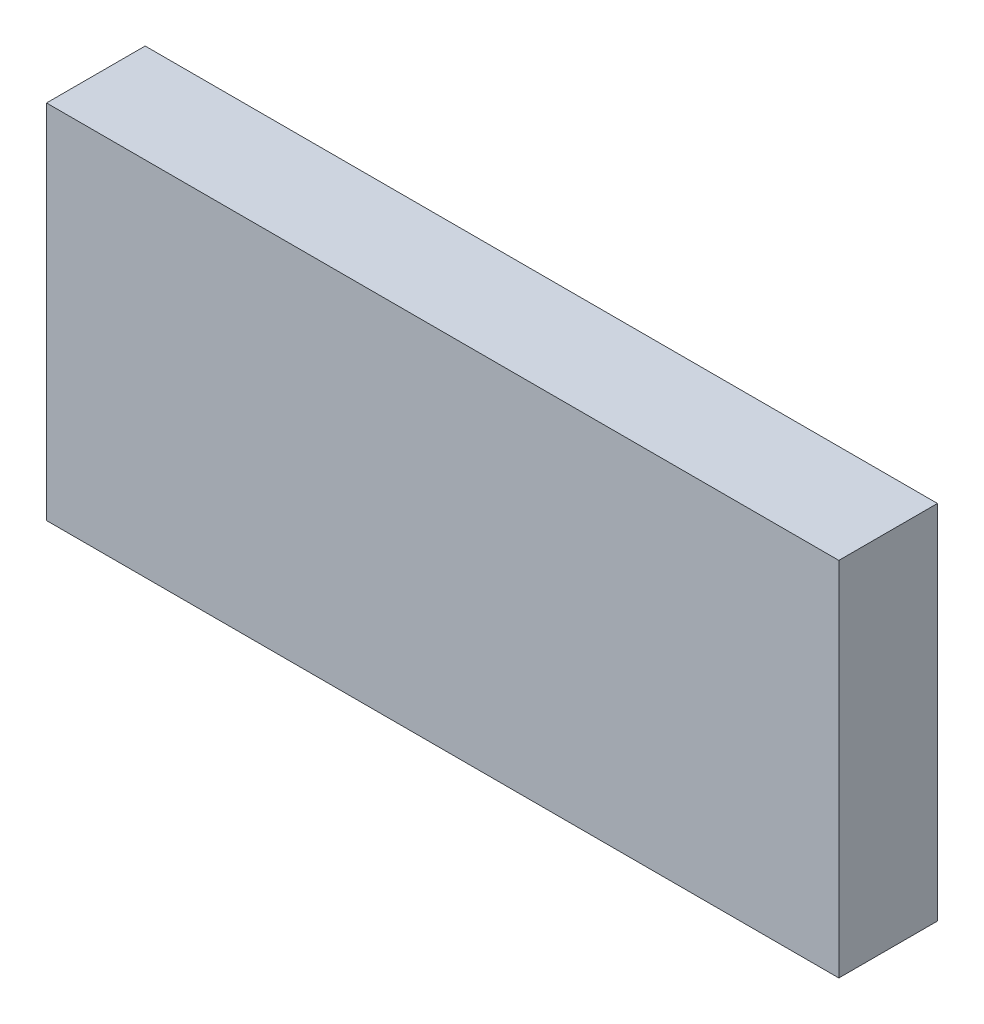
ISO-10303-21;
HEADER;
FILE_DESCRIPTION(('STEP AP214'),'2;1');
FILE_NAME('part.step','',(''),(''),'','','');
FILE_SCHEMA(('AUTOMOTIVE_DESIGN { 1 0 10303 214 1 1 1 1 }'));
ENDSEC;
DATA;
#1=APPLICATION_CONTEXT('core data for automotive mechanical design processes');
#2=APPLICATION_PROTOCOL_DEFINITION('international standard','automotive_design',2000,#1);
#3=PRODUCT_CONTEXT('',#1,'mechanical');
#4=PRODUCT('Part','Part','',(#3));
#5=PRODUCT_RELATED_PRODUCT_CATEGORY('part','',(#4));
#6=PRODUCT_DEFINITION_FORMATION('','',#4);
#7=PRODUCT_DEFINITION_CONTEXT('part definition',#1,'design');
#8=PRODUCT_DEFINITION('design','',#6,#7);
#9=PRODUCT_DEFINITION_SHAPE('','',#8);
#10=(LENGTH_UNIT() NAMED_UNIT(*) SI_UNIT(.MILLI.,.METRE.));
#11=(NAMED_UNIT(*) PLANE_ANGLE_UNIT() SI_UNIT($,.RADIAN.));
#12=(NAMED_UNIT(*) SI_UNIT($,.STERADIAN.) SOLID_ANGLE_UNIT());
#13=UNCERTAINTY_MEASURE_WITH_UNIT(LENGTH_MEASURE(1.E-05),#10,'distance_accuracy_value','');
#14=(GEOMETRIC_REPRESENTATION_CONTEXT(3) GLOBAL_UNCERTAINTY_ASSIGNED_CONTEXT((#13)) GLOBAL_UNIT_ASSIGNED_CONTEXT((#10,
#11,#12)) REPRESENTATION_CONTEXT('',''));
#15=CARTESIAN_POINT('',(0.,0.,0.));
#16=DIRECTION('',(0.,0.,1.));
#17=DIRECTION('',(1.,0.,0.));
#18=AXIS2_PLACEMENT_3D('',#15,#16,#17);
#19=CARTESIAN_POINT('',(153.02484,-69.85,-38.1));
#20=DIRECTION('',(1.,0.,0.));
#21=DIRECTION('',(0.,0.,-1.));
#22=AXIS2_PLACEMENT_3D('',#19,#20,#21);
#23=PLANE('',#22);
#24=DIRECTION('',(0.,1.,0.));
#25=VECTOR('',#24,1.);
#26=CARTESIAN_POINT('',(153.02484,-69.85,0.));
#27=LINE('',#26,#25);
#28=CARTESIAN_POINT('',(153.02484,-69.85,0.));
#29=VERTEX_POINT('',#28);
#30=CARTESIAN_POINT('',(153.02484,69.85,0.));
#31=VERTEX_POINT('',#30);
#32=EDGE_CURVE('E105',#29,#31,#27,.T.);
#33=ORIENTED_EDGE('',*,*,#32,.F.);
#34=DIRECTION('',(0.,0.,1.));
#35=VECTOR('',#34,1.);
#36=CARTESIAN_POINT('',(153.02484,-69.85,-38.1));
#37=LINE('',#36,#35);
#38=CARTESIAN_POINT('',(153.02484,-69.85,-38.1));
#39=VERTEX_POINT('',#38);
#40=EDGE_CURVE('E11',#39,#29,#37,.T.);
#41=ORIENTED_EDGE('',*,*,#40,.F.);
#42=DIRECTION('',(0.,1.,0.));
#43=VECTOR('',#42,1.);
#44=CARTESIAN_POINT('',(153.02484,-69.85,-38.1));
#45=LINE('',#44,#43);
#46=CARTESIAN_POINT('',(153.02484,69.85,-38.1));
#47=VERTEX_POINT('',#46);
#48=EDGE_CURVE('E99',#39,#47,#45,.T.);
#49=ORIENTED_EDGE('',*,*,#48,.T.);
#50=DIRECTION('',(0.,0.,1.));
#51=VECTOR('',#50,1.);
#52=CARTESIAN_POINT('',(153.02484,69.85,-38.1));
#53=LINE('',#52,#51);
#54=EDGE_CURVE('E44',#47,#31,#53,.T.);
#55=ORIENTED_EDGE('',*,*,#54,.T.);
#56=EDGE_LOOP('',(#33,#41,#49,#55));
#57=FACE_BOUND('',#56,.T.);
#58=ADVANCED_FACE('F41',(#57),#23,.T.);
#59=CARTESIAN_POINT('',(-153.02484,-69.85,-38.1));
#60=DIRECTION('',(0.,-1.,0.));
#61=DIRECTION('',(0.,0.,-1.));
#62=AXIS2_PLACEMENT_3D('',#59,#60,#61);
#63=PLANE('',#62);
#64=DIRECTION('',(1.,0.,0.));
#65=VECTOR('',#64,1.);
#66=CARTESIAN_POINT('',(-153.02484,-69.85,0.));
#67=LINE('',#66,#65);
#68=CARTESIAN_POINT('',(-153.02484,-69.85,0.));
#69=VERTEX_POINT('',#68);
#70=EDGE_CURVE('E101',#69,#29,#67,.T.);
#71=ORIENTED_EDGE('',*,*,#70,.F.);
#72=DIRECTION('',(0.,0.,1.));
#73=VECTOR('',#72,1.);
#74=CARTESIAN_POINT('',(-153.02484,-69.85,-38.1));
#75=LINE('',#74,#73);
#76=CARTESIAN_POINT('',(-153.02484,-69.85,-38.1));
#77=VERTEX_POINT('',#76);
#78=EDGE_CURVE('E50',#77,#69,#75,.T.);
#79=ORIENTED_EDGE('',*,*,#78,.F.);
#80=DIRECTION('',(1.,0.,0.));
#81=VECTOR('',#80,1.);
#82=CARTESIAN_POINT('',(-153.02484,-69.85,-38.1));
#83=LINE('',#82,#81);
#84=EDGE_CURVE('E96',#77,#39,#83,.T.);
#85=ORIENTED_EDGE('',*,*,#84,.T.);
#86=ORIENTED_EDGE('',*,*,#40,.T.);
#87=EDGE_LOOP('',(#71,#79,#85,#86));
#88=FACE_BOUND('',#87,.T.);
#89=ADVANCED_FACE('F115',(#88),#63,.T.);
#90=CARTESIAN_POINT('',(-153.02484,-69.85,-38.1));
#91=DIRECTION('',(-1.,0.,0.));
#92=DIRECTION('',(0.,0.,1.));
#93=AXIS2_PLACEMENT_3D('',#90,#91,#92);
#94=PLANE('',#93);
#95=DIRECTION('',(0.,-1.,0.));
#96=VECTOR('',#95,1.);
#97=CARTESIAN_POINT('',(-153.02484,-69.85,0.));
#98=LINE('',#97,#96);
#99=CARTESIAN_POINT('',(-153.02484,69.85,0.));
#100=VERTEX_POINT('',#99);
#101=EDGE_CURVE('E91',#100,#69,#98,.T.);
#102=ORIENTED_EDGE('',*,*,#101,.F.);
#103=DIRECTION('',(0.,0.,1.));
#104=VECTOR('',#103,1.);
#105=CARTESIAN_POINT('',(-153.02484,69.85,-38.1));
#106=LINE('',#105,#104);
#107=CARTESIAN_POINT('',(-153.02484,69.85,-38.1));
#108=VERTEX_POINT('',#107);
#109=EDGE_CURVE('E86',#108,#100,#106,.T.);
#110=ORIENTED_EDGE('',*,*,#109,.F.);
#111=DIRECTION('',(0.,-1.,0.));
#112=VECTOR('',#111,1.);
#113=CARTESIAN_POINT('',(-153.02484,-69.85,-38.1));
#114=LINE('',#113,#112);
#115=EDGE_CURVE('E89',#108,#77,#114,.T.);
#116=ORIENTED_EDGE('',*,*,#115,.T.);
#117=ORIENTED_EDGE('',*,*,#78,.T.);
#118=EDGE_LOOP('',(#102,#110,#116,#117));
#119=FACE_BOUND('',#118,.T.);
#120=ADVANCED_FACE('F88',(#119),#94,.T.);
#121=CARTESIAN_POINT('',(-153.02484,69.85,-38.1));
#122=DIRECTION('',(0.,1.,0.));
#123=DIRECTION('',(0.,0.,1.));
#124=AXIS2_PLACEMENT_3D('',#121,#122,#123);
#125=PLANE('',#124);
#126=DIRECTION('',(-1.,0.,0.));
#127=VECTOR('',#126,1.);
#128=CARTESIAN_POINT('',(-153.02484,69.85,0.));
#129=LINE('',#128,#127);
#130=EDGE_CURVE('E108',#31,#100,#129,.T.);
#131=ORIENTED_EDGE('',*,*,#130,.F.);
#132=ORIENTED_EDGE('',*,*,#54,.F.);
#133=DIRECTION('',(-1.,0.,0.));
#134=VECTOR('',#133,1.);
#135=CARTESIAN_POINT('',(-153.02484,69.85,-38.1));
#136=LINE('',#135,#134);
#137=EDGE_CURVE('E95',#47,#108,#136,.T.);
#138=ORIENTED_EDGE('',*,*,#137,.T.);
#139=ORIENTED_EDGE('',*,*,#109,.T.);
#140=EDGE_LOOP('',(#131,#132,#138,#139));
#141=FACE_BOUND('',#140,.T.);
#142=ADVANCED_FACE('F98',(#141),#125,.T.);
#143=CARTESIAN_POINT('',(0.,0.,-38.1));
#144=DIRECTION('',(0.,0.,-1.));
#145=DIRECTION('',(-1.,0.,0.));
#146=AXIS2_PLACEMENT_3D('',#143,#144,#145);
#147=PLANE('',#146);
#148=ORIENTED_EDGE('',*,*,#48,.F.);
#149=ORIENTED_EDGE('',*,*,#84,.F.);
#150=ORIENTED_EDGE('',*,*,#115,.F.);
#151=ORIENTED_EDGE('',*,*,#137,.F.);
#152=EDGE_LOOP('',(#148,#149,#150,#151));
#153=FACE_BOUND('',#152,.T.);
#154=ADVANCED_FACE('F94',(#153),#147,.T.);
#155=CARTESIAN_POINT('',(0.,0.,0.));
#156=DIRECTION('',(0.,0.,-1.));
#157=DIRECTION('',(-1.,0.,0.));
#158=AXIS2_PLACEMENT_3D('',#155,#156,#157);
#159=PLANE('',#158);
#160=ORIENTED_EDGE('',*,*,#32,.T.);
#161=ORIENTED_EDGE('',*,*,#130,.T.);
#162=ORIENTED_EDGE('',*,*,#101,.T.);
#163=ORIENTED_EDGE('',*,*,#70,.T.);
#164=EDGE_LOOP('',(#160,#161,#162,#163));
#165=FACE_BOUND('',#164,.T.);
#166=ADVANCED_FACE('F114',(#165),#159,.F.);
#167=CLOSED_SHELL('',(#58,#89,#120,#142,#154,#166));
#168=MANIFOLD_SOLID_BREP('B2',#167);
#169=ADVANCED_BREP_SHAPE_REPRESENTATION('',(#18,#168),#14);
#170=SHAPE_DEFINITION_REPRESENTATION(#9,#169);
ENDSEC;
END-ISO-10303-21;
